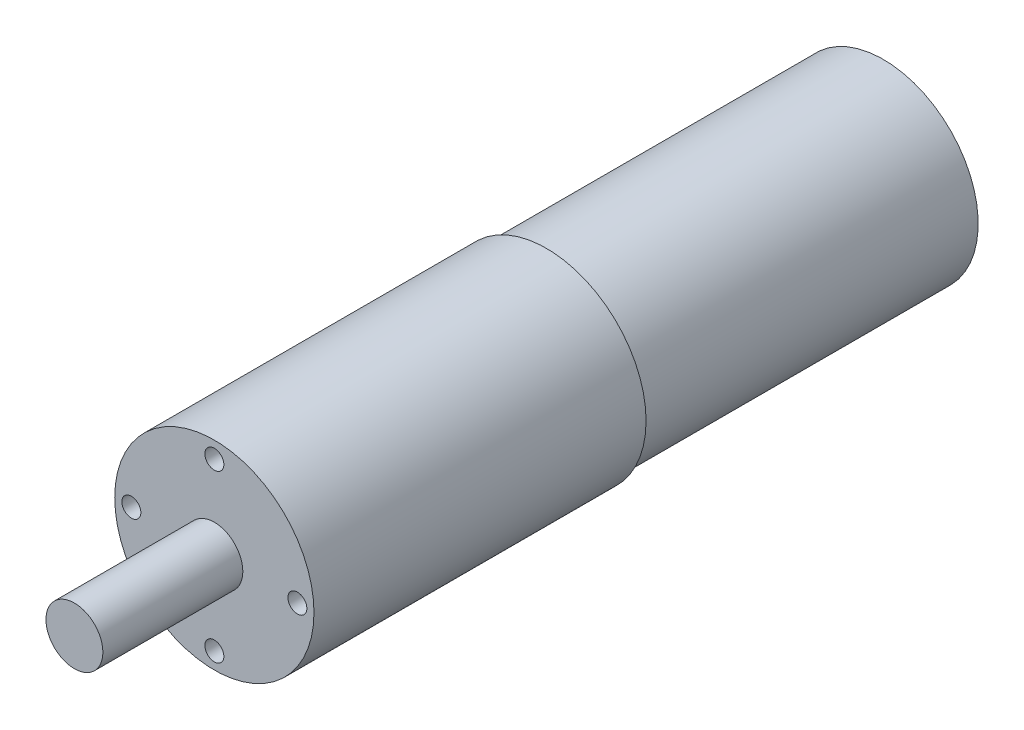
ISO-10303-21;
HEADER;
FILE_DESCRIPTION(('STEP AP214'),'2;1');
FILE_NAME('part.step','',(''),(''),'','','');
FILE_SCHEMA(('AUTOMOTIVE_DESIGN { 1 0 10303 214 1 1 1 1 }'));
ENDSEC;
DATA;
#1=APPLICATION_CONTEXT('core data for automotive mechanical design processes');
#2=APPLICATION_PROTOCOL_DEFINITION('international standard','automotive_design',2000,#1);
#3=PRODUCT_CONTEXT('',#1,'mechanical');
#4=PRODUCT('Part','Part','',(#3));
#5=PRODUCT_RELATED_PRODUCT_CATEGORY('part','',(#4));
#6=PRODUCT_DEFINITION_FORMATION('','',#4);
#7=PRODUCT_DEFINITION_CONTEXT('part definition',#1,'design');
#8=PRODUCT_DEFINITION('design','',#6,#7);
#9=PRODUCT_DEFINITION_SHAPE('','',#8);
#10=(LENGTH_UNIT() NAMED_UNIT(*) SI_UNIT(.MILLI.,.METRE.));
#11=(NAMED_UNIT(*) PLANE_ANGLE_UNIT() SI_UNIT($,.RADIAN.));
#12=(NAMED_UNIT(*) SI_UNIT($,.STERADIAN.) SOLID_ANGLE_UNIT());
#13=UNCERTAINTY_MEASURE_WITH_UNIT(LENGTH_MEASURE(1.E-05),#10,'distance_accuracy_value','');
#14=(GEOMETRIC_REPRESENTATION_CONTEXT(3) GLOBAL_UNCERTAINTY_ASSIGNED_CONTEXT((#13)) GLOBAL_UNIT_ASSIGNED_CONTEXT((#10,
#11,#12)) REPRESENTATION_CONTEXT('',''));
#15=CARTESIAN_POINT('',(0.,0.,0.));
#16=DIRECTION('',(0.,0.,1.));
#17=DIRECTION('',(1.,0.,0.));
#18=AXIS2_PLACEMENT_3D('',#15,#16,#17);
#19=CARTESIAN_POINT('',(0.,0.,70.));
#20=DIRECTION('',(0.,0.,-1.));
#21=DIRECTION('',(-1.,0.,0.));
#22=AXIS2_PLACEMENT_3D('',#19,#20,#21);
#23=CYLINDRICAL_SURFACE('',#22,21.);
#24=CARTESIAN_POINT('',(0.,0.,70.));
#25=DIRECTION('',(0.,0.,1.));
#26=DIRECTION('',(1.,0.,0.));
#27=AXIS2_PLACEMENT_3D('',#24,#25,#26);
#28=CIRCLE('',#27,21.);
#29=CARTESIAN_POINT('',(21.,0.,70.));
#30=VERTEX_POINT('',#29);
#31=EDGE_CURVE('E46',#30,#30,#28,.T.);
#32=ORIENTED_EDGE('',*,*,#31,.F.);
#33=EDGE_LOOP('',(#32));
#34=FACE_BOUND('',#33,.T.);
#35=CARTESIAN_POINT('',(0.,0.,0.));
#36=DIRECTION('',(0.,0.,1.));
#37=DIRECTION('',(1.,0.,0.));
#38=AXIS2_PLACEMENT_3D('',#35,#36,#37);
#39=CIRCLE('',#38,21.);
#40=CARTESIAN_POINT('',(21.,0.,0.));
#41=VERTEX_POINT('',#40);
#42=EDGE_CURVE('E42',#41,#41,#39,.T.);
#43=ORIENTED_EDGE('',*,*,#42,.T.);
#44=EDGE_LOOP('',(#43));
#45=FACE_BOUND('',#44,.T.);
#46=ADVANCED_FACE('F39',(#34,#45),#23,.T.);
#47=CARTESIAN_POINT('',(0.,0.,70.));
#48=DIRECTION('',(0.,0.,1.));
#49=DIRECTION('',(1.,0.,0.));
#50=AXIS2_PLACEMENT_3D('',#47,#48,#49);
#51=PLANE('',#50);
#52=CARTESIAN_POINT('',(0.,0.,70.));
#53=DIRECTION('',(0.,0.,1.));
#54=DIRECTION('',(1.,0.,0.));
#55=AXIS2_PLACEMENT_3D('',#52,#53,#54);
#56=CIRCLE('',#55,6.);
#57=CARTESIAN_POINT('',(6.,0.,70.));
#58=VERTEX_POINT('',#57);
#59=EDGE_CURVE('E58',#58,#58,#56,.T.);
#60=ORIENTED_EDGE('',*,*,#59,.F.);
#61=EDGE_LOOP('',(#60));
#62=FACE_BOUND('',#61,.T.);
#63=CARTESIAN_POINT('',(0.,17.5,70.));
#64=DIRECTION('',(0.,0.,1.));
#65=DIRECTION('',(1.,0.,0.));
#66=AXIS2_PLACEMENT_3D('',#63,#64,#65);
#67=CIRCLE('',#66,2.);
#68=CARTESIAN_POINT('',(2.,17.5,70.));
#69=VERTEX_POINT('',#68);
#70=EDGE_CURVE('E64',#69,#69,#67,.T.);
#71=ORIENTED_EDGE('',*,*,#70,.F.);
#72=EDGE_LOOP('',(#71));
#73=FACE_BOUND('',#72,.T.);
#74=CARTESIAN_POINT('',(17.5,0.,70.));
#75=DIRECTION('',(0.,0.,1.));
#76=DIRECTION('',(1.,0.,0.));
#77=AXIS2_PLACEMENT_3D('',#74,#75,#76);
#78=CIRCLE('',#77,2.);
#79=CARTESIAN_POINT('',(19.5,0.,70.));
#80=VERTEX_POINT('',#79);
#81=EDGE_CURVE('E67',#80,#80,#78,.T.);
#82=ORIENTED_EDGE('',*,*,#81,.F.);
#83=EDGE_LOOP('',(#82));
#84=FACE_BOUND('',#83,.T.);
#85=CARTESIAN_POINT('',(-1.2220184685951E-13,-17.5,70.));
#86=DIRECTION('',(0.,0.,1.));
#87=DIRECTION('',(1.,0.,0.));
#88=AXIS2_PLACEMENT_3D('',#85,#86,#87);
#89=CIRCLE('',#88,2.);
#90=CARTESIAN_POINT('',(1.99999999999988,-17.5,70.));
#91=VERTEX_POINT('',#90);
#92=EDGE_CURVE('E73',#91,#91,#89,.T.);
#93=ORIENTED_EDGE('',*,*,#92,.F.);
#94=EDGE_LOOP('',(#93));
#95=FACE_BOUND('',#94,.T.);
#96=CARTESIAN_POINT('',(-17.5,1.83302770289264E-13,70.));
#97=DIRECTION('',(0.,0.,1.));
#98=DIRECTION('',(1.,0.,0.));
#99=AXIS2_PLACEMENT_3D('',#96,#97,#98);
#100=CIRCLE('',#99,2.);
#101=CARTESIAN_POINT('',(-15.5,1.83302770289264E-13,70.));
#102=VERTEX_POINT('',#101);
#103=EDGE_CURVE('E79',#102,#102,#100,.T.);
#104=ORIENTED_EDGE('',*,*,#103,.F.);
#105=EDGE_LOOP('',(#104));
#106=FACE_BOUND('',#105,.T.);
#107=ORIENTED_EDGE('',*,*,#31,.T.);
#108=EDGE_LOOP('',(#107));
#109=FACE_BOUND('',#108,.T.);
#110=ADVANCED_FACE('F94',(#62,#73,#84,#95,#106,#109),#51,.T.);
#111=CARTESIAN_POINT('',(0.,0.,0.));
#112=DIRECTION('',(0.,0.,1.));
#113=DIRECTION('',(1.,0.,0.));
#114=AXIS2_PLACEMENT_3D('',#111,#112,#113);
#115=PLANE('',#114);
#116=CARTESIAN_POINT('',(0.,0.,0.));
#117=DIRECTION('',(0.,0.,-1.));
#118=DIRECTION('',(-1.,0.,0.));
#119=AXIS2_PLACEMENT_3D('',#116,#117,#118);
#120=CIRCLE('',#119,20.);
#121=CARTESIAN_POINT('',(-20.,0.,0.));
#122=VERTEX_POINT('',#121);
#123=EDGE_CURVE('E10',#122,#122,#120,.T.);
#124=ORIENTED_EDGE('',*,*,#123,.F.);
#125=EDGE_LOOP('',(#124));
#126=FACE_BOUND('',#125,.T.);
#127=ORIENTED_EDGE('',*,*,#42,.F.);
#128=EDGE_LOOP('',(#127));
#129=FACE_BOUND('',#128,.T.);
#130=ADVANCED_FACE('F90',(#126,#129),#115,.F.);
#131=CARTESIAN_POINT('',(-17.5,1.83302770289264E-13,64.));
#132=DIRECTION('',(0.,0.,1.));
#133=DIRECTION('',(1.,0.,0.));
#134=AXIS2_PLACEMENT_3D('',#131,#132,#133);
#135=CYLINDRICAL_SURFACE('',#134,2.);
#136=CARTESIAN_POINT('',(-17.5,1.83302770289264E-13,64.));
#137=DIRECTION('',(0.,0.,1.));
#138=DIRECTION('',(1.,0.,0.));
#139=AXIS2_PLACEMENT_3D('',#136,#137,#138);
#140=CIRCLE('',#139,2.);
#141=CARTESIAN_POINT('',(-15.5,1.83302770289264E-13,64.));
#142=VERTEX_POINT('',#141);
#143=EDGE_CURVE('E57',#142,#142,#140,.T.);
#144=ORIENTED_EDGE('',*,*,#143,.F.);
#145=EDGE_LOOP('',(#144));
#146=FACE_BOUND('',#145,.T.);
#147=ORIENTED_EDGE('',*,*,#103,.T.);
#148=EDGE_LOOP('',(#147));
#149=FACE_BOUND('',#148,.T.);
#150=ADVANCED_FACE('F87',(#146,#149),#135,.F.);
#151=CARTESIAN_POINT('',(-17.5,1.83302770289264E-13,64.));
#152=DIRECTION('',(0.,0.,1.));
#153=DIRECTION('',(1.,0.,0.));
#154=AXIS2_PLACEMENT_3D('',#151,#152,#153);
#155=PLANE('',#154);
#156=ORIENTED_EDGE('',*,*,#143,.T.);
#157=EDGE_LOOP('',(#156));
#158=FACE_BOUND('',#157,.T.);
#159=ADVANCED_FACE('F85',(#158),#155,.T.);
#160=CARTESIAN_POINT('',(-1.2220184685951E-13,-17.5,64.));
#161=DIRECTION('',(0.,0.,1.));
#162=DIRECTION('',(1.,0.,0.));
#163=AXIS2_PLACEMENT_3D('',#160,#161,#162);
#164=CYLINDRICAL_SURFACE('',#163,2.);
#165=CARTESIAN_POINT('',(-1.2220184685951E-13,-17.5,64.));
#166=DIRECTION('',(0.,0.,1.));
#167=DIRECTION('',(1.,0.,0.));
#168=AXIS2_PLACEMENT_3D('',#165,#166,#167);
#169=CIRCLE('',#168,2.);
#170=CARTESIAN_POINT('',(1.99999999999988,-17.5,64.));
#171=VERTEX_POINT('',#170);
#172=EDGE_CURVE('E76',#171,#171,#169,.T.);
#173=ORIENTED_EDGE('',*,*,#172,.F.);
#174=EDGE_LOOP('',(#173));
#175=FACE_BOUND('',#174,.T.);
#176=ORIENTED_EDGE('',*,*,#92,.T.);
#177=EDGE_LOOP('',(#176));
#178=FACE_BOUND('',#177,.T.);
#179=ADVANCED_FACE('F114',(#175,#178),#164,.F.);
#180=CARTESIAN_POINT('',(-1.2220184685951E-13,-17.5,64.));
#181=DIRECTION('',(0.,0.,1.));
#182=DIRECTION('',(1.,0.,0.));
#183=AXIS2_PLACEMENT_3D('',#180,#181,#182);
#184=PLANE('',#183);
#185=ORIENTED_EDGE('',*,*,#172,.T.);
#186=EDGE_LOOP('',(#185));
#187=FACE_BOUND('',#186,.T.);
#188=ADVANCED_FACE('F116',(#187),#184,.T.);
#189=CARTESIAN_POINT('',(17.5,0.,64.));
#190=DIRECTION('',(0.,0.,1.));
#191=DIRECTION('',(1.,0.,0.));
#192=AXIS2_PLACEMENT_3D('',#189,#190,#191);
#193=CYLINDRICAL_SURFACE('',#192,2.);
#194=CARTESIAN_POINT('',(17.5,0.,64.));
#195=DIRECTION('',(0.,0.,1.));
#196=DIRECTION('',(1.,0.,0.));
#197=AXIS2_PLACEMENT_3D('',#194,#195,#196);
#198=CIRCLE('',#197,2.);
#199=CARTESIAN_POINT('',(19.5,0.,64.));
#200=VERTEX_POINT('',#199);
#201=EDGE_CURVE('E70',#200,#200,#198,.T.);
#202=ORIENTED_EDGE('',*,*,#201,.F.);
#203=EDGE_LOOP('',(#202));
#204=FACE_BOUND('',#203,.T.);
#205=ORIENTED_EDGE('',*,*,#81,.T.);
#206=EDGE_LOOP('',(#205));
#207=FACE_BOUND('',#206,.T.);
#208=ADVANCED_FACE('F119',(#204,#207),#193,.F.);
#209=CARTESIAN_POINT('',(17.5,0.,64.));
#210=DIRECTION('',(0.,0.,1.));
#211=DIRECTION('',(1.,0.,0.));
#212=AXIS2_PLACEMENT_3D('',#209,#210,#211);
#213=PLANE('',#212);
#214=ORIENTED_EDGE('',*,*,#201,.T.);
#215=EDGE_LOOP('',(#214));
#216=FACE_BOUND('',#215,.T.);
#217=ADVANCED_FACE('F124',(#216),#213,.T.);
#218=CARTESIAN_POINT('',(0.,17.5,64.));
#219=DIRECTION('',(0.,0.,1.));
#220=DIRECTION('',(1.,0.,0.));
#221=AXIS2_PLACEMENT_3D('',#218,#219,#220);
#222=CYLINDRICAL_SURFACE('',#221,2.);
#223=CARTESIAN_POINT('',(0.,17.5,64.));
#224=DIRECTION('',(0.,0.,1.));
#225=DIRECTION('',(1.,0.,0.));
#226=AXIS2_PLACEMENT_3D('',#223,#224,#225);
#227=CIRCLE('',#226,2.);
#228=CARTESIAN_POINT('',(2.,17.5,64.));
#229=VERTEX_POINT('',#228);
#230=EDGE_CURVE('E61',#229,#229,#227,.T.);
#231=ORIENTED_EDGE('',*,*,#230,.F.);
#232=EDGE_LOOP('',(#231));
#233=FACE_BOUND('',#232,.T.);
#234=ORIENTED_EDGE('',*,*,#70,.T.);
#235=EDGE_LOOP('',(#234));
#236=FACE_BOUND('',#235,.T.);
#237=ADVANCED_FACE('F127',(#233,#236),#222,.F.);
#238=CARTESIAN_POINT('',(0.,17.5,64.));
#239=DIRECTION('',(0.,0.,1.));
#240=DIRECTION('',(1.,0.,0.));
#241=AXIS2_PLACEMENT_3D('',#238,#239,#240);
#242=PLANE('',#241);
#243=ORIENTED_EDGE('',*,*,#230,.T.);
#244=EDGE_LOOP('',(#243));
#245=FACE_BOUND('',#244,.T.);
#246=ADVANCED_FACE('F134',(#245),#242,.T.);
#247=CARTESIAN_POINT('',(0.,0.,99.5));
#248=DIRECTION('',(0.,0.,-1.));
#249=DIRECTION('',(-1.,0.,0.));
#250=AXIS2_PLACEMENT_3D('',#247,#248,#249);
#251=CYLINDRICAL_SURFACE('',#250,6.);
#252=CARTESIAN_POINT('',(0.,0.,99.5));
#253=DIRECTION('',(0.,0.,1.));
#254=DIRECTION('',(1.,0.,0.));
#255=AXIS2_PLACEMENT_3D('',#252,#253,#254);
#256=CIRCLE('',#255,6.);
#257=CARTESIAN_POINT('',(6.,0.,99.5));
#258=VERTEX_POINT('',#257);
#259=EDGE_CURVE('E54',#258,#258,#256,.T.);
#260=ORIENTED_EDGE('',*,*,#259,.F.);
#261=EDGE_LOOP('',(#260));
#262=FACE_BOUND('',#261,.T.);
#263=ORIENTED_EDGE('',*,*,#59,.T.);
#264=EDGE_LOOP('',(#263));
#265=FACE_BOUND('',#264,.T.);
#266=ADVANCED_FACE('F138',(#262,#265),#251,.T.);
#267=CARTESIAN_POINT('',(0.,0.,99.5));
#268=DIRECTION('',(0.,0.,1.));
#269=DIRECTION('',(1.,0.,0.));
#270=AXIS2_PLACEMENT_3D('',#267,#268,#269);
#271=PLANE('',#270);
#272=ORIENTED_EDGE('',*,*,#259,.T.);
#273=EDGE_LOOP('',(#272));
#274=FACE_BOUND('',#273,.T.);
#275=ADVANCED_FACE('F142',(#274),#271,.T.);
#276=CARTESIAN_POINT('',(0.,0.,-71.));
#277=DIRECTION('',(0.,0.,1.));
#278=DIRECTION('',(1.,0.,0.));
#279=AXIS2_PLACEMENT_3D('',#276,#277,#278);
#280=CYLINDRICAL_SURFACE('',#279,20.);
#281=CARTESIAN_POINT('',(0.,0.,-71.));
#282=DIRECTION('',(0.,0.,-1.));
#283=DIRECTION('',(-1.,0.,0.));
#284=AXIS2_PLACEMENT_3D('',#281,#282,#283);
#285=CIRCLE('',#284,20.);
#286=CARTESIAN_POINT('',(-20.,0.,-71.));
#287=VERTEX_POINT('',#286);
#288=EDGE_CURVE('E53',#287,#287,#285,.T.);
#289=ORIENTED_EDGE('',*,*,#288,.F.);
#290=EDGE_LOOP('',(#289));
#291=FACE_BOUND('',#290,.T.);
#292=ORIENTED_EDGE('',*,*,#123,.T.);
#293=EDGE_LOOP('',(#292));
#294=FACE_BOUND('',#293,.T.);
#295=ADVANCED_FACE('F145',(#291,#294),#280,.T.);
#296=CARTESIAN_POINT('',(0.,0.,-71.));
#297=DIRECTION('',(0.,0.,-1.));
#298=DIRECTION('',(-1.,0.,0.));
#299=AXIS2_PLACEMENT_3D('',#296,#297,#298);
#300=PLANE('',#299);
#301=ORIENTED_EDGE('',*,*,#288,.T.);
#302=EDGE_LOOP('',(#301));
#303=FACE_BOUND('',#302,.T.);
#304=ADVANCED_FACE('F148',(#303),#300,.T.);
#305=CLOSED_SHELL('',(#46,#110,#130,#150,#159,#179,#188,#208,#217,#237,#246,#266,#275,#295,#304));
#306=MANIFOLD_SOLID_BREP('B2',#305);
#307=ADVANCED_BREP_SHAPE_REPRESENTATION('',(#18,#306),#14);
#308=SHAPE_DEFINITION_REPRESENTATION(#9,#307);
ENDSEC;
END-ISO-10303-21;
